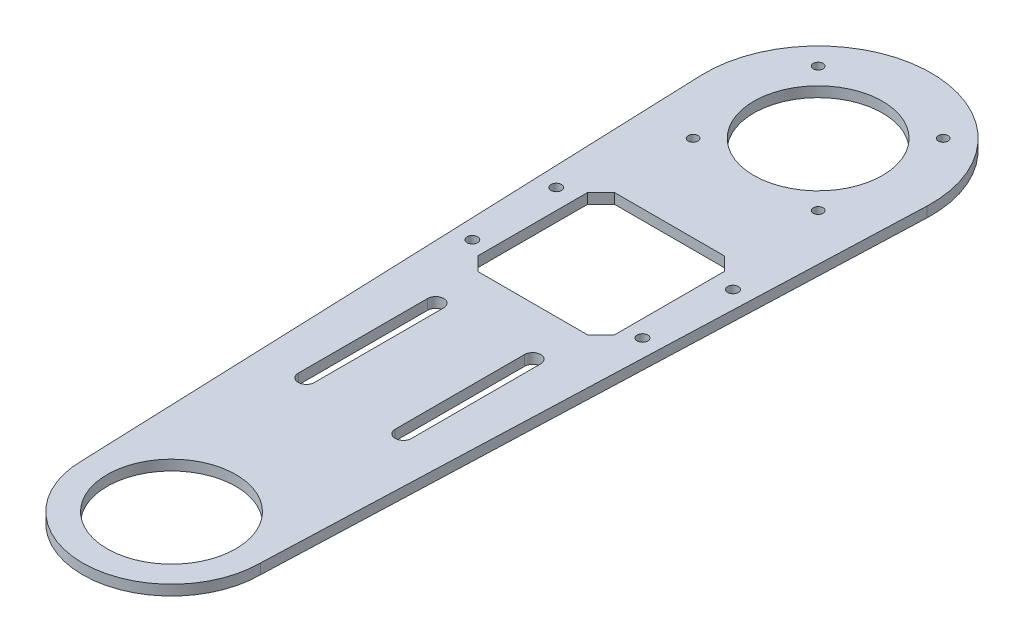
ISO-10303-21;
HEADER;
FILE_DESCRIPTION(('STEP AP214'),'2;1');
FILE_NAME('part.step','',(''),(''),'','','');
FILE_SCHEMA(('AUTOMOTIVE_DESIGN { 1 0 10303 214 1 1 1 1 }'));
ENDSEC;
DATA;
#1=APPLICATION_CONTEXT('core data for automotive mechanical design processes');
#2=APPLICATION_PROTOCOL_DEFINITION('international standard','automotive_design',2000,#1);
#3=PRODUCT_CONTEXT('',#1,'mechanical');
#4=PRODUCT('Part','Part','',(#3));
#5=PRODUCT_RELATED_PRODUCT_CATEGORY('part','',(#4));
#6=PRODUCT_DEFINITION_FORMATION('','',#4);
#7=PRODUCT_DEFINITION_CONTEXT('part definition',#1,'design');
#8=PRODUCT_DEFINITION('design','',#6,#7);
#9=PRODUCT_DEFINITION_SHAPE('','',#8);
#10=(LENGTH_UNIT() NAMED_UNIT(*) SI_UNIT(.MILLI.,.METRE.));
#11=(NAMED_UNIT(*) PLANE_ANGLE_UNIT() SI_UNIT($,.RADIAN.));
#12=(NAMED_UNIT(*) SI_UNIT($,.STERADIAN.) SOLID_ANGLE_UNIT());
#13=UNCERTAINTY_MEASURE_WITH_UNIT(LENGTH_MEASURE(1.E-05),#10,'distance_accuracy_value','');
#14=(GEOMETRIC_REPRESENTATION_CONTEXT(3) GLOBAL_UNCERTAINTY_ASSIGNED_CONTEXT((#13)) GLOBAL_UNIT_ASSIGNED_CONTEXT((#10,
#11,#12)) REPRESENTATION_CONTEXT('',''));
#15=CARTESIAN_POINT('',(0.,0.,0.));
#16=DIRECTION('',(0.,0.,1.));
#17=DIRECTION('',(1.,0.,0.));
#18=AXIS2_PLACEMENT_3D('',#15,#16,#17);
#19=CARTESIAN_POINT('',(31.2181907364059,3.175,1.17454749419578));
#20=DIRECTION('',(-0.999292974733131,0.,-0.0375972159741945));
#21=DIRECTION('',(-0.0375972159741945,0.,0.999292974733131));
#22=AXIS2_PLACEMENT_3D('',#19,#20,#21);
#23=PLANE('',#22);
#24=DIRECTION('',(0.0375972159741945,0.,-0.999292974733131));
#25=VECTOR('',#24,1.);
#26=CARTESIAN_POINT('',(31.2181907364059,0.,1.17454749419578));
#27=LINE('',#26,#25);
#28=CARTESIAN_POINT('',(27.5,0.,100.));
#29=VERTEX_POINT('',#28);
#30=CARTESIAN_POINT('',(34.9752541156596,0.,-98.6840974409032));
#31=VERTEX_POINT('',#30);
#32=EDGE_CURVE('E356',#29,#31,#27,.T.);
#33=ORIENTED_EDGE('',*,*,#32,.T.);
#34=DIRECTION('',(0.,-1.,0.));
#35=VECTOR('',#34,1.);
#36=CARTESIAN_POINT('',(34.9752541156596,3.175,-98.6840974409032));
#37=LINE('',#36,#35);
#38=CARTESIAN_POINT('',(34.9752541156596,3.175,-98.6840974409032));
#39=VERTEX_POINT('',#38);
#40=EDGE_CURVE('E11',#39,#31,#37,.T.);
#41=ORIENTED_EDGE('',*,*,#40,.F.);
#42=DIRECTION('',(0.0375972159741945,0.,-0.999292974733131));
#43=VECTOR('',#42,1.);
#44=CARTESIAN_POINT('',(31.2181907364059,3.175,1.17454749419578));
#45=LINE('',#44,#43);
#46=CARTESIAN_POINT('',(27.5,3.175,100.));
#47=VERTEX_POINT('',#46);
#48=EDGE_CURVE('E365',#47,#39,#45,.T.);
#49=ORIENTED_EDGE('',*,*,#48,.F.);
#50=DIRECTION('',(0.,-1.,0.));
#51=VECTOR('',#50,1.);
#52=CARTESIAN_POINT('',(27.5,3.175,100.));
#53=LINE('',#52,#51);
#54=EDGE_CURVE('E376',#47,#29,#53,.T.);
#55=ORIENTED_EDGE('',*,*,#54,.T.);
#56=EDGE_LOOP('',(#33,#41,#49,#55));
#57=FACE_BOUND('',#56,.T.);
#58=ADVANCED_FACE('F35',(#57),#23,.F.);
#59=CARTESIAN_POINT('',(0.,3.175,-100.));
#60=DIRECTION('',(0.,-1.,0.));
#61=DIRECTION('',(0.,0.,-1.));
#62=AXIS2_PLACEMENT_3D('',#59,#60,#61);
#63=CYLINDRICAL_SURFACE('',#62,35.);
#64=CARTESIAN_POINT('',(0.,0.,-100.));
#65=DIRECTION('',(0.,1.,0.));
#66=DIRECTION('',(0.,0.,1.));
#67=AXIS2_PLACEMENT_3D('',#64,#65,#66);
#68=CIRCLE('',#67,35.);
#69=CARTESIAN_POINT('',(-34.9752541156596,0.,-98.6840974409032));
#70=VERTEX_POINT('',#69);
#71=EDGE_CURVE('E379',#31,#70,#68,.T.);
#72=ORIENTED_EDGE('',*,*,#71,.T.);
#73=DIRECTION('',(0.,-1.,0.));
#74=VECTOR('',#73,1.);
#75=CARTESIAN_POINT('',(-34.9752541156596,3.175,-98.6840974409032));
#76=LINE('',#75,#74);
#77=CARTESIAN_POINT('',(-34.9752541156596,3.175,-98.6840974409032));
#78=VERTEX_POINT('',#77);
#79=EDGE_CURVE('E42',#78,#70,#76,.T.);
#80=ORIENTED_EDGE('',*,*,#79,.F.);
#81=CARTESIAN_POINT('',(0.,3.175,-100.));
#82=DIRECTION('',(0.,1.,0.));
#83=DIRECTION('',(0.,0.,1.));
#84=AXIS2_PLACEMENT_3D('',#81,#82,#83);
#85=CIRCLE('',#84,35.);
#86=EDGE_CURVE('E368',#39,#78,#85,.T.);
#87=ORIENTED_EDGE('',*,*,#86,.F.);
#88=ORIENTED_EDGE('',*,*,#40,.T.);
#89=EDGE_LOOP('',(#72,#80,#87,#88));
#90=FACE_BOUND('',#89,.T.);
#91=ADVANCED_FACE('F395',(#90),#63,.T.);
#92=CARTESIAN_POINT('',(-31.2181907364059,3.175,1.17454749419578));
#93=DIRECTION('',(-0.999292974733131,0.,0.0375972159741945));
#94=DIRECTION('',(0.0375972159741945,0.,0.999292974733131));
#95=AXIS2_PLACEMENT_3D('',#92,#93,#94);
#96=PLANE('',#95);
#97=DIRECTION('',(-0.0375972159741945,0.,-0.999292974733131));
#98=VECTOR('',#97,1.);
#99=CARTESIAN_POINT('',(-31.2181907364059,0.,1.17454749419578));
#100=LINE('',#99,#98);
#101=CARTESIAN_POINT('',(-27.5,0.,100.));
#102=VERTEX_POINT('',#101);
#103=EDGE_CURVE('E382',#102,#70,#100,.T.);
#104=ORIENTED_EDGE('',*,*,#103,.F.);
#105=DIRECTION('',(0.,-1.,0.));
#106=VECTOR('',#105,1.);
#107=CARTESIAN_POINT('',(-27.5,3.175,100.));
#108=LINE('',#107,#106);
#109=CARTESIAN_POINT('',(-27.5,3.175,100.));
#110=VERTEX_POINT('',#109);
#111=EDGE_CURVE('E388',#110,#102,#108,.T.);
#112=ORIENTED_EDGE('',*,*,#111,.F.);
#113=DIRECTION('',(-0.0375972159741945,0.,-0.999292974733131));
#114=VECTOR('',#113,1.);
#115=CARTESIAN_POINT('',(-31.2181907364059,3.175,1.17454749419578));
#116=LINE('',#115,#114);
#117=EDGE_CURVE('E371',#110,#78,#116,.T.);
#118=ORIENTED_EDGE('',*,*,#117,.T.);
#119=ORIENTED_EDGE('',*,*,#79,.T.);
#120=EDGE_LOOP('',(#104,#112,#118,#119));
#121=FACE_BOUND('',#120,.T.);
#122=ADVANCED_FACE('F392',(#121),#96,.T.);
#123=CARTESIAN_POINT('',(0.,3.175,100.));
#124=DIRECTION('',(0.,-1.,0.));
#125=DIRECTION('',(0.,0.,-1.));
#126=AXIS2_PLACEMENT_3D('',#123,#124,#125);
#127=CYLINDRICAL_SURFACE('',#126,27.5);
#128=CARTESIAN_POINT('',(0.,0.,100.));
#129=DIRECTION('',(0.,1.,0.));
#130=DIRECTION('',(0.,0.,1.));
#131=AXIS2_PLACEMENT_3D('',#128,#129,#130);
#132=CIRCLE('',#131,27.5);
#133=EDGE_CURVE('E369',#102,#29,#132,.T.);
#134=ORIENTED_EDGE('',*,*,#133,.T.);
#135=ORIENTED_EDGE('',*,*,#54,.F.);
#136=CARTESIAN_POINT('',(0.,3.175,100.));
#137=DIRECTION('',(0.,1.,0.));
#138=DIRECTION('',(0.,0.,1.));
#139=AXIS2_PLACEMENT_3D('',#136,#137,#138);
#140=CIRCLE('',#139,27.5);
#141=EDGE_CURVE('E374',#110,#47,#140,.T.);
#142=ORIENTED_EDGE('',*,*,#141,.F.);
#143=ORIENTED_EDGE('',*,*,#111,.T.);
#144=EDGE_LOOP('',(#134,#135,#142,#143));
#145=FACE_BOUND('',#144,.T.);
#146=ADVANCED_FACE('F402',(#145),#127,.T.);
#147=CARTESIAN_POINT('',(0.,3.175,0.));
#148=DIRECTION('',(0.,1.,0.));
#149=DIRECTION('',(0.,0.,1.));
#150=AXIS2_PLACEMENT_3D('',#147,#148,#149);
#151=PLANE('',#150);
#152=CARTESIAN_POINT('',(15.,3.175,43.3));
#153=DIRECTION('',(0.,1.,0.));
#154=DIRECTION('',(0.,0.,1.));
#155=AXIS2_PLACEMENT_3D('',#152,#153,#154);
#156=CIRCLE('',#155,2.5);
#157=CARTESIAN_POINT('',(12.5,3.175,43.3));
#158=VERTEX_POINT('',#157);
#159=CARTESIAN_POINT('',(17.5,3.175,43.3));
#160=VERTEX_POINT('',#159);
#161=EDGE_CURVE('E49',#158,#160,#156,.T.);
#162=ORIENTED_EDGE('',*,*,#161,.F.);
#163=DIRECTION('',(0.,0.,1.));
#164=VECTOR('',#163,1.);
#165=CARTESIAN_POINT('',(12.5,3.175,3.29999999999997));
#166=LINE('',#165,#164);
#167=CARTESIAN_POINT('',(12.5,3.175,3.29999999999997));
#168=VERTEX_POINT('',#167);
#169=EDGE_CURVE('E192',#168,#158,#166,.T.);
#170=ORIENTED_EDGE('',*,*,#169,.F.);
#171=CARTESIAN_POINT('',(15.,3.175,3.29999999999997));
#172=DIRECTION('',(0.,1.,0.));
#173=DIRECTION('',(0.,0.,1.));
#174=AXIS2_PLACEMENT_3D('',#171,#172,#173);
#175=CIRCLE('',#174,2.5);
#176=CARTESIAN_POINT('',(17.5,3.175,3.29999999999997));
#177=VERTEX_POINT('',#176);
#178=EDGE_CURVE('E195',#177,#168,#175,.T.);
#179=ORIENTED_EDGE('',*,*,#178,.F.);
#180=DIRECTION('',(0.,0.,-1.));
#181=VECTOR('',#180,1.);
#182=CARTESIAN_POINT('',(17.5,3.175,43.3));
#183=LINE('',#182,#181);
#184=EDGE_CURVE('E201',#160,#177,#183,.T.);
#185=ORIENTED_EDGE('',*,*,#184,.F.);
#186=EDGE_LOOP('',(#162,#170,#179,#185));
#187=FACE_BOUND('',#186,.T.);
#188=CARTESIAN_POINT('',(-15.,3.175,43.3));
#189=DIRECTION('',(0.,1.,0.));
#190=DIRECTION('',(0.,0.,1.));
#191=AXIS2_PLACEMENT_3D('',#188,#189,#190);
#192=CIRCLE('',#191,2.5);
#193=CARTESIAN_POINT('',(-17.5,3.175,43.3));
#194=VERTEX_POINT('',#193);
#195=CARTESIAN_POINT('',(-12.5,3.175,43.3));
#196=VERTEX_POINT('',#195);
#197=EDGE_CURVE('E57',#194,#196,#192,.T.);
#198=ORIENTED_EDGE('',*,*,#197,.F.);
#199=DIRECTION('',(0.,0.,1.));
#200=VECTOR('',#199,1.);
#201=CARTESIAN_POINT('',(-17.5,3.175,3.29999999999997));
#202=LINE('',#201,#200);
#203=CARTESIAN_POINT('',(-17.5,3.175,3.29999999999997));
#204=VERTEX_POINT('',#203);
#205=EDGE_CURVE('E216',#204,#194,#202,.T.);
#206=ORIENTED_EDGE('',*,*,#205,.F.);
#207=CARTESIAN_POINT('',(-15.,3.175,3.29999999999997));
#208=DIRECTION('',(0.,1.,0.));
#209=DIRECTION('',(0.,0.,1.));
#210=AXIS2_PLACEMENT_3D('',#207,#208,#209);
#211=CIRCLE('',#210,2.5);
#212=CARTESIAN_POINT('',(-12.5,3.175,3.29999999999997));
#213=VERTEX_POINT('',#212);
#214=EDGE_CURVE('E230',#213,#204,#211,.T.);
#215=ORIENTED_EDGE('',*,*,#214,.F.);
#216=DIRECTION('',(0.,0.,-1.));
#217=VECTOR('',#216,1.);
#218=CARTESIAN_POINT('',(-12.5,3.175,43.3));
#219=LINE('',#218,#217);
#220=EDGE_CURVE('E227',#196,#213,#219,.T.);
#221=ORIENTED_EDGE('',*,*,#220,.F.);
#222=EDGE_LOOP('',(#198,#206,#215,#221));
#223=FACE_BOUND('',#222,.T.);
#224=CARTESIAN_POINT('',(27.331724457447,3.175,-46.3404551588972));
#225=DIRECTION('',(0.,1.,0.));
#226=DIRECTION('',(0.,0.,1.));
#227=AXIS2_PLACEMENT_3D('',#224,#225,#226);
#228=CIRCLE('',#227,1.62499999999999);
#229=CARTESIAN_POINT('',(27.331724457447,3.175,-44.7154551588972));
#230=VERTEX_POINT('',#229);
#231=EDGE_CURVE('E208',#230,#230,#228,.T.);
#232=ORIENTED_EDGE('',*,*,#231,.F.);
#233=EDGE_LOOP('',(#232));
#234=FACE_BOUND('',#233,.T.);
#235=CARTESIAN_POINT('',(26.3165996261438,3.175,-19.3595448411027));
#236=DIRECTION('',(0.,1.,0.));
#237=DIRECTION('',(0.,0.,1.));
#238=AXIS2_PLACEMENT_3D('',#235,#236,#237);
#239=CIRCLE('',#238,1.62499999999999);
#240=CARTESIAN_POINT('',(26.3165996261438,3.175,-17.7345448411027));
#241=VERTEX_POINT('',#240);
#242=EDGE_CURVE('E257',#241,#241,#239,.T.);
#243=ORIENTED_EDGE('',*,*,#242,.F.);
#244=EDGE_LOOP('',(#243));
#245=FACE_BOUND('',#244,.T.);
#246=CARTESIAN_POINT('',(-26.3165996261438,3.175,-19.3595448411027));
#247=DIRECTION('',(0.,1.,0.));
#248=DIRECTION('',(0.,0.,1.));
#249=AXIS2_PLACEMENT_3D('',#246,#247,#248);
#250=CIRCLE('',#249,1.62499999999999);
#251=CARTESIAN_POINT('',(-26.3165996261438,3.175,-17.7345448411027));
#252=VERTEX_POINT('',#251);
#253=EDGE_CURVE('E251',#252,#252,#250,.T.);
#254=ORIENTED_EDGE('',*,*,#253,.F.);
#255=EDGE_LOOP('',(#254));
#256=FACE_BOUND('',#255,.T.);
#257=CARTESIAN_POINT('',(-27.331724457447,3.175,-46.3404551588972));
#258=DIRECTION('',(0.,1.,0.));
#259=DIRECTION('',(0.,0.,1.));
#260=AXIS2_PLACEMENT_3D('',#257,#258,#259);
#261=CIRCLE('',#260,1.625);
#262=CARTESIAN_POINT('',(-27.331724457447,3.175,-44.7154551588972));
#263=VERTEX_POINT('',#262);
#264=EDGE_CURVE('E245',#263,#263,#261,.T.);
#265=ORIENTED_EDGE('',*,*,#264,.F.);
#266=EDGE_LOOP('',(#265));
#267=FACE_BOUND('',#266,.T.);
#268=DIRECTION('',(0.,0.,1.));
#269=VECTOR('',#268,1.);
#270=CARTESIAN_POINT('',(-21.15,3.175,-15.8719300090005));
#271=LINE('',#270,#269);
#272=CARTESIAN_POINT('',(-21.15,3.175,-49.8280699909994));
#273=VERTEX_POINT('',#272);
#274=CARTESIAN_POINT('',(-21.15,3.175,-15.8719300090005));
#275=VERTEX_POINT('',#274);
#276=EDGE_CURVE('E244',#273,#275,#271,.T.);
#277=ORIENTED_EDGE('',*,*,#276,.F.);
#278=DIRECTION('',(-0.707106781186548,0.,0.707106781186547));
#279=VECTOR('',#278,1.);
#280=CARTESIAN_POINT('',(-21.15,3.175,-49.8280699909994));
#281=LINE('',#280,#279);
#282=CARTESIAN_POINT('',(-16.9780699909993,3.175,-54.));
#283=VERTEX_POINT('',#282);
#284=EDGE_CURVE('E269',#283,#273,#281,.T.);
#285=ORIENTED_EDGE('',*,*,#284,.F.);
#286=DIRECTION('',(-1.,0.,0.));
#287=VECTOR('',#286,1.);
#288=CARTESIAN_POINT('',(-16.9780699909993,3.175,-54.));
#289=LINE('',#288,#287);
#290=CARTESIAN_POINT('',(16.9780699909994,3.175,-54.));
#291=VERTEX_POINT('',#290);
#292=EDGE_CURVE('E307',#291,#283,#289,.T.);
#293=ORIENTED_EDGE('',*,*,#292,.F.);
#294=DIRECTION('',(-0.707106781186544,0.,-0.70710678118655));
#295=VECTOR('',#294,1.);
#296=CARTESIAN_POINT('',(16.9780699909994,3.175,-54.));
#297=LINE('',#296,#295);
#298=CARTESIAN_POINT('',(21.15,3.175,-49.8280699909994));
#299=VERTEX_POINT('',#298);
#300=EDGE_CURVE('E304',#299,#291,#297,.T.);
#301=ORIENTED_EDGE('',*,*,#300,.F.);
#302=DIRECTION('',(0.,0.,-1.));
#303=VECTOR('',#302,1.);
#304=CARTESIAN_POINT('',(21.15,3.175,-49.8280699909994));
#305=LINE('',#304,#303);
#306=CARTESIAN_POINT('',(21.15,3.175,-15.8719300090007));
#307=VERTEX_POINT('',#306);
#308=EDGE_CURVE('E301',#307,#299,#305,.T.);
#309=ORIENTED_EDGE('',*,*,#308,.F.);
#310=DIRECTION('',(0.707106781186546,0.,-0.707106781186549));
#311=VECTOR('',#310,1.);
#312=CARTESIAN_POINT('',(21.15,3.175,-15.8719300090007));
#313=LINE('',#312,#311);
#314=CARTESIAN_POINT('',(16.9780699909994,3.175,-11.7));
#315=VERTEX_POINT('',#314);
#316=EDGE_CURVE('E298',#315,#307,#313,.T.);
#317=ORIENTED_EDGE('',*,*,#316,.F.);
#318=DIRECTION('',(1.,0.,0.));
#319=VECTOR('',#318,1.);
#320=CARTESIAN_POINT('',(16.9780699909994,3.175,-11.7));
#321=LINE('',#320,#319);
#322=CARTESIAN_POINT('',(-16.9780699909993,3.175,-11.7));
#323=VERTEX_POINT('',#322);
#324=EDGE_CURVE('E295',#323,#315,#321,.T.);
#325=ORIENTED_EDGE('',*,*,#324,.F.);
#326=DIRECTION('',(0.707106781186563,0.,0.707106781186532));
#327=VECTOR('',#326,1.);
#328=CARTESIAN_POINT('',(-16.9780699909993,3.175,-11.7));
#329=LINE('',#328,#327);
#330=EDGE_CURVE('E292',#275,#323,#329,.T.);
#331=ORIENTED_EDGE('',*,*,#330,.F.);
#332=EDGE_LOOP('',(#277,#285,#293,#301,#309,#317,#325,#331));
#333=FACE_BOUND('',#332,.T.);
#334=CARTESIAN_POINT('',(-19.3393704654521,3.175,-80.6606295345479));
#335=DIRECTION('',(0.,1.,0.));
#336=DIRECTION('',(0.,0.,1.));
#337=AXIS2_PLACEMENT_3D('',#334,#335,#336);
#338=CIRCLE('',#337,1.5);
#339=CARTESIAN_POINT('',(-19.3393704654521,3.175,-79.1606295345479));
#340=VERTEX_POINT('',#339);
#341=EDGE_CURVE('E314',#340,#340,#338,.T.);
#342=ORIENTED_EDGE('',*,*,#341,.F.);
#343=EDGE_LOOP('',(#342));
#344=FACE_BOUND('',#343,.T.);
#345=CARTESIAN_POINT('',(-19.3393704654521,3.175,-119.339370465452));
#346=DIRECTION('',(0.,1.,0.));
#347=DIRECTION('',(0.,0.,1.));
#348=AXIS2_PLACEMENT_3D('',#345,#346,#347);
#349=CIRCLE('',#348,1.5);
#350=CARTESIAN_POINT('',(-19.3393704654521,3.175,-117.839370465452));
#351=VERTEX_POINT('',#350);
#352=EDGE_CURVE('E339',#351,#351,#349,.T.);
#353=ORIENTED_EDGE('',*,*,#352,.F.);
#354=EDGE_LOOP('',(#353));
#355=FACE_BOUND('',#354,.T.);
#356=CARTESIAN_POINT('',(19.3393704654521,3.175,-119.339370465452));
#357=DIRECTION('',(0.,1.,0.));
#358=DIRECTION('',(0.,0.,1.));
#359=AXIS2_PLACEMENT_3D('',#356,#357,#358);
#360=CIRCLE('',#359,1.5);
#361=CARTESIAN_POINT('',(19.3393704654521,3.175,-117.839370465452));
#362=VERTEX_POINT('',#361);
#363=EDGE_CURVE('E333',#362,#362,#360,.T.);
#364=ORIENTED_EDGE('',*,*,#363,.F.);
#365=EDGE_LOOP('',(#364));
#366=FACE_BOUND('',#365,.T.);
#367=CARTESIAN_POINT('',(19.3393704654521,3.175,-80.6606295345479));
#368=DIRECTION('',(0.,1.,0.));
#369=DIRECTION('',(0.,0.,1.));
#370=AXIS2_PLACEMENT_3D('',#367,#368,#369);
#371=CIRCLE('',#370,1.5);
#372=CARTESIAN_POINT('',(19.3393704654521,3.175,-79.1606295345479));
#373=VERTEX_POINT('',#372);
#374=EDGE_CURVE('E332',#373,#373,#371,.T.);
#375=ORIENTED_EDGE('',*,*,#374,.F.);
#376=EDGE_LOOP('',(#375));
#377=FACE_BOUND('',#376,.T.);
#378=CARTESIAN_POINT('',(0.,3.175,100.));
#379=DIRECTION('',(0.,1.,0.));
#380=DIRECTION('',(0.,0.,1.));
#381=AXIS2_PLACEMENT_3D('',#378,#379,#380);
#382=CIRCLE('',#381,19.9);
#383=CARTESIAN_POINT('',(0.,3.175,119.9));
#384=VERTEX_POINT('',#383);
#385=EDGE_CURVE('E357',#384,#384,#382,.T.);
#386=ORIENTED_EDGE('',*,*,#385,.F.);
#387=EDGE_LOOP('',(#386));
#388=FACE_BOUND('',#387,.T.);
#389=CARTESIAN_POINT('',(0.,3.175,-100.));
#390=DIRECTION('',(0.,1.,0.));
#391=DIRECTION('',(0.,0.,1.));
#392=AXIS2_PLACEMENT_3D('',#389,#390,#391);
#393=CIRCLE('',#392,19.9);
#394=CARTESIAN_POINT('',(0.,3.175,-80.1));
#395=VERTEX_POINT('',#394);
#396=EDGE_CURVE('E350',#395,#395,#393,.T.);
#397=ORIENTED_EDGE('',*,*,#396,.F.);
#398=EDGE_LOOP('',(#397));
#399=FACE_BOUND('',#398,.T.);
#400=ORIENTED_EDGE('',*,*,#48,.T.);
#401=ORIENTED_EDGE('',*,*,#86,.T.);
#402=ORIENTED_EDGE('',*,*,#117,.F.);
#403=ORIENTED_EDGE('',*,*,#141,.T.);
#404=EDGE_LOOP('',(#400,#401,#402,#403));
#405=FACE_BOUND('',#404,.T.);
#406=ADVANCED_FACE('F407',(#187,#223,#234,#245,#256,#267,#333,#344,#355,#366,#377,#388,#399,
#405),#151,.T.);
#407=CARTESIAN_POINT('',(0.,0.,0.));
#408=DIRECTION('',(0.,1.,0.));
#409=DIRECTION('',(0.,0.,1.));
#410=AXIS2_PLACEMENT_3D('',#407,#408,#409);
#411=PLANE('',#410);
#412=DIRECTION('',(0.,0.,1.));
#413=VECTOR('',#412,1.);
#414=CARTESIAN_POINT('',(12.5,0.,3.29999999999997));
#415=LINE('',#414,#413);
#416=CARTESIAN_POINT('',(12.5,0.,3.29999999999997));
#417=VERTEX_POINT('',#416);
#418=CARTESIAN_POINT('',(12.5,0.,43.3));
#419=VERTEX_POINT('',#418);
#420=EDGE_CURVE('E179',#417,#419,#415,.T.);
#421=ORIENTED_EDGE('',*,*,#420,.T.);
#422=CARTESIAN_POINT('',(15.,0.,43.3));
#423=DIRECTION('',(0.,1.,0.));
#424=DIRECTION('',(0.,0.,1.));
#425=AXIS2_PLACEMENT_3D('',#422,#423,#424);
#426=CIRCLE('',#425,2.5);
#427=CARTESIAN_POINT('',(17.5,0.,43.3));
#428=VERTEX_POINT('',#427);
#429=EDGE_CURVE('E173',#419,#428,#426,.T.);
#430=ORIENTED_EDGE('',*,*,#429,.T.);
#431=DIRECTION('',(0.,0.,-1.));
#432=VECTOR('',#431,1.);
#433=CARTESIAN_POINT('',(17.5,0.,43.3));
#434=LINE('',#433,#432);
#435=CARTESIAN_POINT('',(17.5,0.,3.29999999999997));
#436=VERTEX_POINT('',#435);
#437=EDGE_CURVE('E183',#428,#436,#434,.T.);
#438=ORIENTED_EDGE('',*,*,#437,.T.);
#439=CARTESIAN_POINT('',(15.,0.,3.29999999999997));
#440=DIRECTION('',(0.,1.,0.));
#441=DIRECTION('',(0.,0.,1.));
#442=AXIS2_PLACEMENT_3D('',#439,#440,#441);
#443=CIRCLE('',#442,2.5);
#444=EDGE_CURVE('E187',#436,#417,#443,.T.);
#445=ORIENTED_EDGE('',*,*,#444,.T.);
#446=EDGE_LOOP('',(#421,#430,#438,#445));
#447=FACE_BOUND('',#446,.T.);
#448=DIRECTION('',(0.,0.,1.));
#449=VECTOR('',#448,1.);
#450=CARTESIAN_POINT('',(-17.5,0.,3.29999999999997));
#451=LINE('',#450,#449);
#452=CARTESIAN_POINT('',(-17.5,0.,3.29999999999997));
#453=VERTEX_POINT('',#452);
#454=CARTESIAN_POINT('',(-17.5,0.,43.3));
#455=VERTEX_POINT('',#454);
#456=EDGE_CURVE('E222',#453,#455,#451,.T.);
#457=ORIENTED_EDGE('',*,*,#456,.T.);
#458=CARTESIAN_POINT('',(-15.,0.,43.3));
#459=DIRECTION('',(0.,1.,0.));
#460=DIRECTION('',(0.,0.,1.));
#461=AXIS2_PLACEMENT_3D('',#458,#459,#460);
#462=CIRCLE('',#461,2.5);
#463=CARTESIAN_POINT('',(-12.5,0.,43.3));
#464=VERTEX_POINT('',#463);
#465=EDGE_CURVE('E212',#455,#464,#462,.T.);
#466=ORIENTED_EDGE('',*,*,#465,.T.);
#467=DIRECTION('',(0.,0.,-1.));
#468=VECTOR('',#467,1.);
#469=CARTESIAN_POINT('',(-12.5,0.,43.3));
#470=LINE('',#469,#468);
#471=CARTESIAN_POINT('',(-12.5,0.,3.29999999999997));
#472=VERTEX_POINT('',#471);
#473=EDGE_CURVE('E215',#464,#472,#470,.T.);
#474=ORIENTED_EDGE('',*,*,#473,.T.);
#475=CARTESIAN_POINT('',(-15.,0.,3.29999999999997));
#476=DIRECTION('',(0.,1.,0.));
#477=DIRECTION('',(0.,0.,1.));
#478=AXIS2_PLACEMENT_3D('',#475,#476,#477);
#479=CIRCLE('',#478,2.5);
#480=EDGE_CURVE('E219',#472,#453,#479,.T.);
#481=ORIENTED_EDGE('',*,*,#480,.T.);
#482=EDGE_LOOP('',(#457,#466,#474,#481));
#483=FACE_BOUND('',#482,.T.);
#484=CARTESIAN_POINT('',(27.331724457447,0.,-46.3404551588972));
#485=DIRECTION('',(0.,1.,0.));
#486=DIRECTION('',(0.,0.,1.));
#487=AXIS2_PLACEMENT_3D('',#484,#485,#486);
#488=CIRCLE('',#487,1.62499999999999);
#489=CARTESIAN_POINT('',(27.331724457447,0.,-44.7154551588972));
#490=VERTEX_POINT('',#489);
#491=EDGE_CURVE('E260',#490,#490,#488,.T.);
#492=ORIENTED_EDGE('',*,*,#491,.T.);
#493=EDGE_LOOP('',(#492));
#494=FACE_BOUND('',#493,.T.);
#495=CARTESIAN_POINT('',(26.3165996261438,0.,-19.3595448411027));
#496=DIRECTION('',(0.,1.,0.));
#497=DIRECTION('',(0.,0.,1.));
#498=AXIS2_PLACEMENT_3D('',#495,#496,#497);
#499=CIRCLE('',#498,1.62499999999999);
#500=CARTESIAN_POINT('',(26.3165996261438,0.,-17.7345448411027));
#501=VERTEX_POINT('',#500);
#502=EDGE_CURVE('E254',#501,#501,#499,.T.);
#503=ORIENTED_EDGE('',*,*,#502,.T.);
#504=EDGE_LOOP('',(#503));
#505=FACE_BOUND('',#504,.T.);
#506=CARTESIAN_POINT('',(-26.3165996261438,0.,-19.3595448411027));
#507=DIRECTION('',(0.,1.,0.));
#508=DIRECTION('',(0.,0.,1.));
#509=AXIS2_PLACEMENT_3D('',#506,#507,#508);
#510=CIRCLE('',#509,1.62499999999999);
#511=CARTESIAN_POINT('',(-26.3165996261438,0.,-17.7345448411027));
#512=VERTEX_POINT('',#511);
#513=EDGE_CURVE('E248',#512,#512,#510,.T.);
#514=ORIENTED_EDGE('',*,*,#513,.T.);
#515=EDGE_LOOP('',(#514));
#516=FACE_BOUND('',#515,.T.);
#517=CARTESIAN_POINT('',(-27.331724457447,0.,-46.3404551588972));
#518=DIRECTION('',(0.,1.,0.));
#519=DIRECTION('',(0.,0.,1.));
#520=AXIS2_PLACEMENT_3D('',#517,#518,#519);
#521=CIRCLE('',#520,1.625);
#522=CARTESIAN_POINT('',(-27.331724457447,0.,-44.7154551588972));
#523=VERTEX_POINT('',#522);
#524=EDGE_CURVE('E241',#523,#523,#521,.T.);
#525=ORIENTED_EDGE('',*,*,#524,.T.);
#526=EDGE_LOOP('',(#525));
#527=FACE_BOUND('',#526,.T.);
#528=DIRECTION('',(-0.707106781186548,0.,0.707106781186547));
#529=VECTOR('',#528,1.);
#530=CARTESIAN_POINT('',(-21.15,0.,-49.8280699909994));
#531=LINE('',#530,#529);
#532=CARTESIAN_POINT('',(-16.9780699909993,0.,-54.));
#533=VERTEX_POINT('',#532);
#534=CARTESIAN_POINT('',(-21.15,0.,-49.8280699909994));
#535=VERTEX_POINT('',#534);
#536=EDGE_CURVE('E287',#533,#535,#531,.T.);
#537=ORIENTED_EDGE('',*,*,#536,.T.);
#538=DIRECTION('',(0.,0.,1.));
#539=VECTOR('',#538,1.);
#540=CARTESIAN_POINT('',(-21.15,0.,-15.8719300090005));
#541=LINE('',#540,#539);
#542=CARTESIAN_POINT('',(-21.15,0.,-15.8719300090005));
#543=VERTEX_POINT('',#542);
#544=EDGE_CURVE('E265',#535,#543,#541,.T.);
#545=ORIENTED_EDGE('',*,*,#544,.T.);
#546=DIRECTION('',(0.707106781186563,0.,0.707106781186532));
#547=VECTOR('',#546,1.);
#548=CARTESIAN_POINT('',(-16.9780699909993,0.,-11.7));
#549=LINE('',#548,#547);
#550=CARTESIAN_POINT('',(-16.9780699909993,0.,-11.7));
#551=VERTEX_POINT('',#550);
#552=EDGE_CURVE('E268',#543,#551,#549,.T.);
#553=ORIENTED_EDGE('',*,*,#552,.T.);
#554=DIRECTION('',(1.,0.,0.));
#555=VECTOR('',#554,1.);
#556=CARTESIAN_POINT('',(16.9780699909994,0.,-11.7));
#557=LINE('',#556,#555);
#558=CARTESIAN_POINT('',(16.9780699909994,0.,-11.7));
#559=VERTEX_POINT('',#558);
#560=EDGE_CURVE('E272',#551,#559,#557,.T.);
#561=ORIENTED_EDGE('',*,*,#560,.T.);
#562=DIRECTION('',(0.707106781186546,0.,-0.707106781186549));
#563=VECTOR('',#562,1.);
#564=CARTESIAN_POINT('',(21.15,0.,-15.8719300090007));
#565=LINE('',#564,#563);
#566=CARTESIAN_POINT('',(21.15,0.,-15.8719300090007));
#567=VERTEX_POINT('',#566);
#568=EDGE_CURVE('E275',#559,#567,#565,.T.);
#569=ORIENTED_EDGE('',*,*,#568,.T.);
#570=DIRECTION('',(0.,0.,-1.));
#571=VECTOR('',#570,1.);
#572=CARTESIAN_POINT('',(21.15,0.,-49.8280699909994));
#573=LINE('',#572,#571);
#574=CARTESIAN_POINT('',(21.15,0.,-49.8280699909994));
#575=VERTEX_POINT('',#574);
#576=EDGE_CURVE('E278',#567,#575,#573,.T.);
#577=ORIENTED_EDGE('',*,*,#576,.T.);
#578=DIRECTION('',(-0.707106781186544,0.,-0.70710678118655));
#579=VECTOR('',#578,1.);
#580=CARTESIAN_POINT('',(16.9780699909994,0.,-54.));
#581=LINE('',#580,#579);
#582=CARTESIAN_POINT('',(16.9780699909994,0.,-54.));
#583=VERTEX_POINT('',#582);
#584=EDGE_CURVE('E281',#575,#583,#581,.T.);
#585=ORIENTED_EDGE('',*,*,#584,.T.);
#586=DIRECTION('',(-1.,0.,0.));
#587=VECTOR('',#586,1.);
#588=CARTESIAN_POINT('',(-16.9780699909993,0.,-54.));
#589=LINE('',#588,#587);
#590=EDGE_CURVE('E284',#583,#533,#589,.T.);
#591=ORIENTED_EDGE('',*,*,#590,.T.);
#592=EDGE_LOOP('',(#537,#545,#553,#561,#569,#577,#585,#591));
#593=FACE_BOUND('',#592,.T.);
#594=CARTESIAN_POINT('',(-19.3393704654521,0.,-80.6606295345479));
#595=DIRECTION('',(0.,1.,0.));
#596=DIRECTION('',(0.,0.,1.));
#597=AXIS2_PLACEMENT_3D('',#594,#595,#596);
#598=CIRCLE('',#597,1.5);
#599=CARTESIAN_POINT('',(-19.3393704654521,0.,-79.1606295345479));
#600=VERTEX_POINT('',#599);
#601=EDGE_CURVE('E342',#600,#600,#598,.T.);
#602=ORIENTED_EDGE('',*,*,#601,.T.);
#603=EDGE_LOOP('',(#602));
#604=FACE_BOUND('',#603,.T.);
#605=CARTESIAN_POINT('',(-19.3393704654521,0.,-119.339370465452));
#606=DIRECTION('',(0.,1.,0.));
#607=DIRECTION('',(0.,0.,1.));
#608=AXIS2_PLACEMENT_3D('',#605,#606,#607);
#609=CIRCLE('',#608,1.5);
#610=CARTESIAN_POINT('',(-19.3393704654521,0.,-117.839370465452));
#611=VERTEX_POINT('',#610);
#612=EDGE_CURVE('E336',#611,#611,#609,.T.);
#613=ORIENTED_EDGE('',*,*,#612,.T.);
#614=EDGE_LOOP('',(#613));
#615=FACE_BOUND('',#614,.T.);
#616=CARTESIAN_POINT('',(19.3393704654521,0.,-119.339370465452));
#617=DIRECTION('',(0.,1.,0.));
#618=DIRECTION('',(0.,0.,1.));
#619=AXIS2_PLACEMENT_3D('',#616,#617,#618);
#620=CIRCLE('',#619,1.5);
#621=CARTESIAN_POINT('',(19.3393704654521,0.,-117.839370465452));
#622=VERTEX_POINT('',#621);
#623=EDGE_CURVE('E329',#622,#622,#620,.T.);
#624=ORIENTED_EDGE('',*,*,#623,.T.);
#625=EDGE_LOOP('',(#624));
#626=FACE_BOUND('',#625,.T.);
#627=CARTESIAN_POINT('',(19.3393704654521,0.,-80.6606295345479));
#628=DIRECTION('',(0.,1.,0.));
#629=DIRECTION('',(0.,0.,1.));
#630=AXIS2_PLACEMENT_3D('',#627,#628,#629);
#631=CIRCLE('',#630,1.5);
#632=CARTESIAN_POINT('',(19.3393704654521,0.,-79.1606295345479));
#633=VERTEX_POINT('',#632);
#634=EDGE_CURVE('E347',#633,#633,#631,.T.);
#635=ORIENTED_EDGE('',*,*,#634,.T.);
#636=EDGE_LOOP('',(#635));
#637=FACE_BOUND('',#636,.T.);
#638=CARTESIAN_POINT('',(0.,0.,100.));
#639=DIRECTION('',(0.,1.,0.));
#640=DIRECTION('',(0.,0.,1.));
#641=AXIS2_PLACEMENT_3D('',#638,#639,#640);
#642=CIRCLE('',#641,19.9);
#643=CARTESIAN_POINT('',(0.,0.,119.9));
#644=VERTEX_POINT('',#643);
#645=EDGE_CURVE('E353',#644,#644,#642,.T.);
#646=ORIENTED_EDGE('',*,*,#645,.T.);
#647=EDGE_LOOP('',(#646));
#648=FACE_BOUND('',#647,.T.);
#649=CARTESIAN_POINT('',(0.,0.,-100.));
#650=DIRECTION('',(0.,1.,0.));
#651=DIRECTION('',(0.,0.,1.));
#652=AXIS2_PLACEMENT_3D('',#649,#650,#651);
#653=CIRCLE('',#652,19.9);
#654=CARTESIAN_POINT('',(0.,0.,-80.1));
#655=VERTEX_POINT('',#654);
#656=EDGE_CURVE('E360',#655,#655,#653,.T.);
#657=ORIENTED_EDGE('',*,*,#656,.T.);
#658=EDGE_LOOP('',(#657));
#659=FACE_BOUND('',#658,.T.);
#660=ORIENTED_EDGE('',*,*,#32,.F.);
#661=ORIENTED_EDGE('',*,*,#133,.F.);
#662=ORIENTED_EDGE('',*,*,#103,.T.);
#663=ORIENTED_EDGE('',*,*,#71,.F.);
#664=EDGE_LOOP('',(#660,#661,#662,#663));
#665=FACE_BOUND('',#664,.T.);
#666=ADVANCED_FACE('F189',(#447,#483,#494,#505,#516,#527,#593,#604,#615,#626,#637,#648,#659,
#665),#411,.F.);
#667=CARTESIAN_POINT('',(0.,0.,-100.));
#668=DIRECTION('',(0.,1.,0.));
#669=DIRECTION('',(0.,0.,1.));
#670=AXIS2_PLACEMENT_3D('',#667,#668,#669);
#671=CYLINDRICAL_SURFACE('',#670,19.9);
#672=ORIENTED_EDGE('',*,*,#656,.F.);
#673=EDGE_LOOP('',(#672));
#674=FACE_BOUND('',#673,.T.);
#675=ORIENTED_EDGE('',*,*,#396,.T.);
#676=EDGE_LOOP('',(#675));
#677=FACE_BOUND('',#676,.T.);
#678=ADVANCED_FACE('F415',(#674,#677),#671,.F.);
#679=CARTESIAN_POINT('',(0.,0.,100.));
#680=DIRECTION('',(0.,1.,0.));
#681=DIRECTION('',(0.,0.,1.));
#682=AXIS2_PLACEMENT_3D('',#679,#680,#681);
#683=CYLINDRICAL_SURFACE('',#682,19.9);
#684=ORIENTED_EDGE('',*,*,#645,.F.);
#685=EDGE_LOOP('',(#684));
#686=FACE_BOUND('',#685,.T.);
#687=ORIENTED_EDGE('',*,*,#385,.T.);
#688=EDGE_LOOP('',(#687));
#689=FACE_BOUND('',#688,.T.);
#690=ADVANCED_FACE('F444',(#686,#689),#683,.F.);
#691=CARTESIAN_POINT('',(19.3393704654521,0.,-80.6606295345479));
#692=DIRECTION('',(0.,1.,0.));
#693=DIRECTION('',(0.,0.,1.));
#694=AXIS2_PLACEMENT_3D('',#691,#692,#693);
#695=CYLINDRICAL_SURFACE('',#694,1.5);
#696=ORIENTED_EDGE('',*,*,#634,.F.);
#697=EDGE_LOOP('',(#696));
#698=FACE_BOUND('',#697,.T.);
#699=ORIENTED_EDGE('',*,*,#374,.T.);
#700=EDGE_LOOP('',(#699));
#701=FACE_BOUND('',#700,.T.);
#702=ADVANCED_FACE('F454',(#698,#701),#695,.F.);
#703=CARTESIAN_POINT('',(19.3393704654521,0.,-119.339370465452));
#704=DIRECTION('',(0.,1.,0.));
#705=DIRECTION('',(0.,0.,1.));
#706=AXIS2_PLACEMENT_3D('',#703,#704,#705);
#707=CYLINDRICAL_SURFACE('',#706,1.5);
#708=ORIENTED_EDGE('',*,*,#623,.F.);
#709=EDGE_LOOP('',(#708));
#710=FACE_BOUND('',#709,.T.);
#711=ORIENTED_EDGE('',*,*,#363,.T.);
#712=EDGE_LOOP('',(#711));
#713=FACE_BOUND('',#712,.T.);
#714=ADVANCED_FACE('F464',(#710,#713),#707,.F.);
#715=CARTESIAN_POINT('',(-19.3393704654521,0.,-119.339370465452));
#716=DIRECTION('',(0.,1.,0.));
#717=DIRECTION('',(0.,0.,1.));
#718=AXIS2_PLACEMENT_3D('',#715,#716,#717);
#719=CYLINDRICAL_SURFACE('',#718,1.5);
#720=ORIENTED_EDGE('',*,*,#612,.F.);
#721=EDGE_LOOP('',(#720));
#722=FACE_BOUND('',#721,.T.);
#723=ORIENTED_EDGE('',*,*,#352,.T.);
#724=EDGE_LOOP('',(#723));
#725=FACE_BOUND('',#724,.T.);
#726=ADVANCED_FACE('F474',(#722,#725),#719,.F.);
#727=CARTESIAN_POINT('',(-19.3393704654521,0.,-80.6606295345479));
#728=DIRECTION('',(0.,1.,0.));
#729=DIRECTION('',(0.,0.,1.));
#730=AXIS2_PLACEMENT_3D('',#727,#728,#729);
#731=CYLINDRICAL_SURFACE('',#730,1.5);
#732=ORIENTED_EDGE('',*,*,#601,.F.);
#733=EDGE_LOOP('',(#732));
#734=FACE_BOUND('',#733,.T.);
#735=ORIENTED_EDGE('',*,*,#341,.T.);
#736=EDGE_LOOP('',(#735));
#737=FACE_BOUND('',#736,.T.);
#738=ADVANCED_FACE('F484',(#734,#737),#731,.F.);
#739=CARTESIAN_POINT('',(-21.15,0.,-15.8719300090005));
#740=DIRECTION('',(-1.,0.,0.));
#741=DIRECTION('',(0.,0.,1.));
#742=AXIS2_PLACEMENT_3D('',#739,#740,#741);
#743=PLANE('',#742);
#744=ORIENTED_EDGE('',*,*,#276,.T.);
#745=DIRECTION('',(0.,1.,0.));
#746=VECTOR('',#745,1.);
#747=CARTESIAN_POINT('',(-21.15,0.,-15.8719300090005));
#748=LINE('',#747,#746);
#749=EDGE_CURVE('E290',#543,#275,#748,.T.);
#750=ORIENTED_EDGE('',*,*,#749,.F.);
#751=ORIENTED_EDGE('',*,*,#544,.F.);
#752=DIRECTION('',(0.,1.,0.));
#753=VECTOR('',#752,1.);
#754=CARTESIAN_POINT('',(-21.15,0.,-49.8280699909994));
#755=LINE('',#754,#753);
#756=EDGE_CURVE('E312',#535,#273,#755,.T.);
#757=ORIENTED_EDGE('',*,*,#756,.T.);
#758=EDGE_LOOP('',(#744,#750,#751,#757));
#759=FACE_BOUND('',#758,.T.);
#760=ADVANCED_FACE('F494',(#759),#743,.F.);
#761=CARTESIAN_POINT('',(-21.15,0.,-49.8280699909994));
#762=DIRECTION('',(-0.707106781186547,0.,-0.707106781186548));
#763=DIRECTION('',(-0.707106781186548,0.,0.707106781186547));
#764=AXIS2_PLACEMENT_3D('',#761,#762,#763);
#765=PLANE('',#764);
#766=ORIENTED_EDGE('',*,*,#284,.T.);
#767=ORIENTED_EDGE('',*,*,#756,.F.);
#768=ORIENTED_EDGE('',*,*,#536,.F.);
#769=DIRECTION('',(0.,1.,0.));
#770=VECTOR('',#769,1.);
#771=CARTESIAN_POINT('',(-16.9780699909993,0.,-54.));
#772=LINE('',#771,#770);
#773=EDGE_CURVE('E315',#533,#283,#772,.T.);
#774=ORIENTED_EDGE('',*,*,#773,.T.);
#775=EDGE_LOOP('',(#766,#767,#768,#774));
#776=FACE_BOUND('',#775,.T.);
#777=ADVANCED_FACE('F504',(#776),#765,.F.);
#778=CARTESIAN_POINT('',(-16.9780699909993,0.,-54.));
#779=DIRECTION('',(0.,0.,-1.));
#780=DIRECTION('',(-1.,0.,0.));
#781=AXIS2_PLACEMENT_3D('',#778,#779,#780);
#782=PLANE('',#781);
#783=ORIENTED_EDGE('',*,*,#292,.T.);
#784=ORIENTED_EDGE('',*,*,#773,.F.);
#785=ORIENTED_EDGE('',*,*,#590,.F.);
#786=DIRECTION('',(0.,1.,0.));
#787=VECTOR('',#786,1.);
#788=CARTESIAN_POINT('',(16.9780699909994,0.,-54.));
#789=LINE('',#788,#787);
#790=EDGE_CURVE('E317',#583,#291,#789,.T.);
#791=ORIENTED_EDGE('',*,*,#790,.T.);
#792=EDGE_LOOP('',(#783,#784,#785,#791));
#793=FACE_BOUND('',#792,.T.);
#794=ADVANCED_FACE('F514',(#793),#782,.F.);
#795=CARTESIAN_POINT('',(16.9780699909994,0.,-54.));
#796=DIRECTION('',(0.707106781186551,0.,-0.707106781186545));
#797=DIRECTION('',(-0.707106781186545,0.,-0.70710678118655));
#798=AXIS2_PLACEMENT_3D('',#795,#796,#797);
#799=PLANE('',#798);
#800=ORIENTED_EDGE('',*,*,#300,.T.);
#801=ORIENTED_EDGE('',*,*,#790,.F.);
#802=ORIENTED_EDGE('',*,*,#584,.F.);
#803=DIRECTION('',(0.,1.,0.));
#804=VECTOR('',#803,1.);
#805=CARTESIAN_POINT('',(21.15,0.,-49.8280699909994));
#806=LINE('',#805,#804);
#807=EDGE_CURVE('E319',#575,#299,#806,.T.);
#808=ORIENTED_EDGE('',*,*,#807,.T.);
#809=EDGE_LOOP('',(#800,#801,#802,#808));
#810=FACE_BOUND('',#809,.T.);
#811=ADVANCED_FACE('F524',(#810),#799,.F.);
#812=CARTESIAN_POINT('',(21.15,0.,-49.8280699909994));
#813=DIRECTION('',(1.,0.,0.));
#814=DIRECTION('',(0.,0.,-1.));
#815=AXIS2_PLACEMENT_3D('',#812,#813,#814);
#816=PLANE('',#815);
#817=ORIENTED_EDGE('',*,*,#308,.T.);
#818=ORIENTED_EDGE('',*,*,#807,.F.);
#819=ORIENTED_EDGE('',*,*,#576,.F.);
#820=DIRECTION('',(0.,1.,0.));
#821=VECTOR('',#820,1.);
#822=CARTESIAN_POINT('',(21.15,0.,-15.8719300090007));
#823=LINE('',#822,#821);
#824=EDGE_CURVE('E321',#567,#307,#823,.T.);
#825=ORIENTED_EDGE('',*,*,#824,.T.);
#826=EDGE_LOOP('',(#817,#818,#819,#825));
#827=FACE_BOUND('',#826,.T.);
#828=ADVANCED_FACE('F534',(#827),#816,.F.);
#829=CARTESIAN_POINT('',(21.15,0.,-15.8719300090007));
#830=DIRECTION('',(0.707106781186549,0.,0.707106781186546));
#831=DIRECTION('',(0.707106781186546,0.,-0.707106781186549));
#832=AXIS2_PLACEMENT_3D('',#829,#830,#831);
#833=PLANE('',#832);
#834=ORIENTED_EDGE('',*,*,#316,.T.);
#835=ORIENTED_EDGE('',*,*,#824,.F.);
#836=ORIENTED_EDGE('',*,*,#568,.F.);
#837=DIRECTION('',(0.,1.,0.));
#838=VECTOR('',#837,1.);
#839=CARTESIAN_POINT('',(16.9780699909994,0.,-11.7));
#840=LINE('',#839,#838);
#841=EDGE_CURVE('E323',#559,#315,#840,.T.);
#842=ORIENTED_EDGE('',*,*,#841,.T.);
#843=EDGE_LOOP('',(#834,#835,#836,#842));
#844=FACE_BOUND('',#843,.T.);
#845=ADVANCED_FACE('F544',(#844),#833,.F.);
#846=CARTESIAN_POINT('',(16.9780699909994,0.,-11.7));
#847=DIRECTION('',(0.,0.,1.));
#848=DIRECTION('',(1.,0.,0.));
#849=AXIS2_PLACEMENT_3D('',#846,#847,#848);
#850=PLANE('',#849);
#851=ORIENTED_EDGE('',*,*,#324,.T.);
#852=ORIENTED_EDGE('',*,*,#841,.F.);
#853=ORIENTED_EDGE('',*,*,#560,.F.);
#854=DIRECTION('',(0.,1.,0.));
#855=VECTOR('',#854,1.);
#856=CARTESIAN_POINT('',(-16.9780699909993,0.,-11.7));
#857=LINE('',#856,#855);
#858=EDGE_CURVE('E325',#551,#323,#857,.T.);
#859=ORIENTED_EDGE('',*,*,#858,.T.);
#860=EDGE_LOOP('',(#851,#852,#853,#859));
#861=FACE_BOUND('',#860,.T.);
#862=ADVANCED_FACE('F554',(#861),#850,.F.);
#863=CARTESIAN_POINT('',(-16.9780699909993,0.,-11.7));
#864=DIRECTION('',(-0.707106781186532,0.,0.707106781186563));
#865=DIRECTION('',(0.707106781186563,0.,0.707106781186532));
#866=AXIS2_PLACEMENT_3D('',#863,#864,#865);
#867=PLANE('',#866);
#868=ORIENTED_EDGE('',*,*,#330,.T.);
#869=ORIENTED_EDGE('',*,*,#858,.F.);
#870=ORIENTED_EDGE('',*,*,#552,.F.);
#871=ORIENTED_EDGE('',*,*,#749,.T.);
#872=EDGE_LOOP('',(#868,#869,#870,#871));
#873=FACE_BOUND('',#872,.T.);
#874=ADVANCED_FACE('F564',(#873),#867,.F.);
#875=CARTESIAN_POINT('',(-27.331724457447,0.,-46.3404551588972));
#876=DIRECTION('',(0.,1.,0.));
#877=DIRECTION('',(0.,0.,1.));
#878=AXIS2_PLACEMENT_3D('',#875,#876,#877);
#879=CYLINDRICAL_SURFACE('',#878,1.625);
#880=ORIENTED_EDGE('',*,*,#524,.F.);
#881=EDGE_LOOP('',(#880));
#882=FACE_BOUND('',#881,.T.);
#883=ORIENTED_EDGE('',*,*,#264,.T.);
#884=EDGE_LOOP('',(#883));
#885=FACE_BOUND('',#884,.T.);
#886=ADVANCED_FACE('F574',(#882,#885),#879,.F.);
#887=CARTESIAN_POINT('',(-26.3165996261438,0.,-19.3595448411027));
#888=DIRECTION('',(0.,1.,0.));
#889=DIRECTION('',(0.,0.,1.));
#890=AXIS2_PLACEMENT_3D('',#887,#888,#889);
#891=CYLINDRICAL_SURFACE('',#890,1.62499999999999);
#892=ORIENTED_EDGE('',*,*,#513,.F.);
#893=EDGE_LOOP('',(#892));
#894=FACE_BOUND('',#893,.T.);
#895=ORIENTED_EDGE('',*,*,#253,.T.);
#896=EDGE_LOOP('',(#895));
#897=FACE_BOUND('',#896,.T.);
#898=ADVANCED_FACE('F584',(#894,#897),#891,.F.);
#899=CARTESIAN_POINT('',(26.3165996261438,0.,-19.3595448411027));
#900=DIRECTION('',(0.,1.,0.));
#901=DIRECTION('',(0.,0.,1.));
#902=AXIS2_PLACEMENT_3D('',#899,#900,#901);
#903=CYLINDRICAL_SURFACE('',#902,1.62499999999999);
#904=ORIENTED_EDGE('',*,*,#502,.F.);
#905=EDGE_LOOP('',(#904));
#906=FACE_BOUND('',#905,.T.);
#907=ORIENTED_EDGE('',*,*,#242,.T.);
#908=EDGE_LOOP('',(#907));
#909=FACE_BOUND('',#908,.T.);
#910=ADVANCED_FACE('F594',(#906,#909),#903,.F.);
#911=CARTESIAN_POINT('',(27.331724457447,0.,-46.3404551588972));
#912=DIRECTION('',(0.,1.,0.));
#913=DIRECTION('',(0.,0.,1.));
#914=AXIS2_PLACEMENT_3D('',#911,#912,#913);
#915=CYLINDRICAL_SURFACE('',#914,1.62499999999999);
#916=ORIENTED_EDGE('',*,*,#491,.F.);
#917=EDGE_LOOP('',(#916));
#918=FACE_BOUND('',#917,.T.);
#919=ORIENTED_EDGE('',*,*,#231,.T.);
#920=EDGE_LOOP('',(#919));
#921=FACE_BOUND('',#920,.T.);
#922=ADVANCED_FACE('F604',(#918,#921),#915,.F.);
#923=CARTESIAN_POINT('',(-15.,0.,43.3));
#924=DIRECTION('',(0.,1.,0.));
#925=DIRECTION('',(0.,0.,1.));
#926=AXIS2_PLACEMENT_3D('',#923,#924,#925);
#927=CYLINDRICAL_SURFACE('',#926,2.5);
#928=ORIENTED_EDGE('',*,*,#197,.T.);
#929=DIRECTION('',(0.,1.,0.));
#930=VECTOR('',#929,1.);
#931=CARTESIAN_POINT('',(-12.5,0.,43.3));
#932=LINE('',#931,#930);
#933=EDGE_CURVE('E225',#464,#196,#932,.T.);
#934=ORIENTED_EDGE('',*,*,#933,.F.);
#935=ORIENTED_EDGE('',*,*,#465,.F.);
#936=DIRECTION('',(0.,1.,0.));
#937=VECTOR('',#936,1.);
#938=CARTESIAN_POINT('',(-17.5,0.,43.3));
#939=LINE('',#938,#937);
#940=EDGE_CURVE('E202',#455,#194,#939,.T.);
#941=ORIENTED_EDGE('',*,*,#940,.T.);
#942=EDGE_LOOP('',(#928,#934,#935,#941));
#943=FACE_BOUND('',#942,.T.);
#944=ADVANCED_FACE('F613',(#943),#927,.F.);
#945=CARTESIAN_POINT('',(-17.5,0.,3.29999999999997));
#946=DIRECTION('',(-1.,0.,0.));
#947=DIRECTION('',(0.,0.,1.));
#948=AXIS2_PLACEMENT_3D('',#945,#946,#947);
#949=PLANE('',#948);
#950=ORIENTED_EDGE('',*,*,#205,.T.);
#951=ORIENTED_EDGE('',*,*,#940,.F.);
#952=ORIENTED_EDGE('',*,*,#456,.F.);
#953=DIRECTION('',(0.,1.,0.));
#954=VECTOR('',#953,1.);
#955=CARTESIAN_POINT('',(-17.5,0.,3.29999999999997));
#956=LINE('',#955,#954);
#957=EDGE_CURVE('E236',#453,#204,#956,.T.);
#958=ORIENTED_EDGE('',*,*,#957,.T.);
#959=EDGE_LOOP('',(#950,#951,#952,#958));
#960=FACE_BOUND('',#959,.T.);
#961=ADVANCED_FACE('F632',(#960),#949,.F.);
#962=CARTESIAN_POINT('',(-15.,0.,3.29999999999997));
#963=DIRECTION('',(0.,1.,0.));
#964=DIRECTION('',(0.,0.,1.));
#965=AXIS2_PLACEMENT_3D('',#962,#963,#964);
#966=CYLINDRICAL_SURFACE('',#965,2.5);
#967=ORIENTED_EDGE('',*,*,#214,.T.);
#968=ORIENTED_EDGE('',*,*,#957,.F.);
#969=ORIENTED_EDGE('',*,*,#480,.F.);
#970=DIRECTION('',(0.,1.,0.));
#971=VECTOR('',#970,1.);
#972=CARTESIAN_POINT('',(-12.5,0.,3.29999999999997));
#973=LINE('',#972,#971);
#974=EDGE_CURVE('E238',#472,#213,#973,.T.);
#975=ORIENTED_EDGE('',*,*,#974,.T.);
#976=EDGE_LOOP('',(#967,#968,#969,#975));
#977=FACE_BOUND('',#976,.T.);
#978=ADVANCED_FACE('F641',(#977),#966,.F.);
#979=CARTESIAN_POINT('',(-12.5,0.,43.3));
#980=DIRECTION('',(1.,0.,0.));
#981=DIRECTION('',(0.,0.,-1.));
#982=AXIS2_PLACEMENT_3D('',#979,#980,#981);
#983=PLANE('',#982);
#984=ORIENTED_EDGE('',*,*,#220,.T.);
#985=ORIENTED_EDGE('',*,*,#974,.F.);
#986=ORIENTED_EDGE('',*,*,#473,.F.);
#987=ORIENTED_EDGE('',*,*,#933,.T.);
#988=EDGE_LOOP('',(#984,#985,#986,#987));
#989=FACE_BOUND('',#988,.T.);
#990=ADVANCED_FACE('F651',(#989),#983,.F.);
#991=CARTESIAN_POINT('',(15.,0.,43.3));
#992=DIRECTION('',(0.,1.,0.));
#993=DIRECTION('',(0.,0.,1.));
#994=AXIS2_PLACEMENT_3D('',#991,#992,#993);
#995=CYLINDRICAL_SURFACE('',#994,2.5);
#996=ORIENTED_EDGE('',*,*,#161,.T.);
#997=DIRECTION('',(0.,1.,0.));
#998=VECTOR('',#997,1.);
#999=CARTESIAN_POINT('',(17.5,0.,43.3));
#1000=LINE('',#999,#998);
#1001=EDGE_CURVE('E169',#428,#160,#1000,.T.);
#1002=ORIENTED_EDGE('',*,*,#1001,.F.);
#1003=ORIENTED_EDGE('',*,*,#429,.F.);
#1004=DIRECTION('',(0.,1.,0.));
#1005=VECTOR('',#1004,1.);
#1006=CARTESIAN_POINT('',(12.5,0.,43.3));
#1007=LINE('',#1006,#1005);
#1008=EDGE_CURVE('E206',#419,#158,#1007,.T.);
#1009=ORIENTED_EDGE('',*,*,#1008,.T.);
#1010=EDGE_LOOP('',(#996,#1002,#1003,#1009));
#1011=FACE_BOUND('',#1010,.T.);
#1012=ADVANCED_FACE('F171',(#1011),#995,.F.);
#1013=CARTESIAN_POINT('',(12.5,0.,3.29999999999997));
#1014=DIRECTION('',(-1.,0.,0.));
#1015=DIRECTION('',(0.,0.,1.));
#1016=AXIS2_PLACEMENT_3D('',#1013,#1014,#1015);
#1017=PLANE('',#1016);
#1018=ORIENTED_EDGE('',*,*,#169,.T.);
#1019=ORIENTED_EDGE('',*,*,#1008,.F.);
#1020=ORIENTED_EDGE('',*,*,#420,.F.);
#1021=DIRECTION('',(0.,1.,0.));
#1022=VECTOR('',#1021,1.);
#1023=CARTESIAN_POINT('',(12.5,0.,3.29999999999997));
#1024=LINE('',#1023,#1022);
#1025=EDGE_CURVE('E209',#417,#168,#1024,.T.);
#1026=ORIENTED_EDGE('',*,*,#1025,.T.);
#1027=EDGE_LOOP('',(#1018,#1019,#1020,#1026));
#1028=FACE_BOUND('',#1027,.T.);
#1029=ADVANCED_FACE('F670',(#1028),#1017,.F.);
#1030=CARTESIAN_POINT('',(15.,0.,3.29999999999997));
#1031=DIRECTION('',(0.,1.,0.));
#1032=DIRECTION('',(0.,0.,1.));
#1033=AXIS2_PLACEMENT_3D('',#1030,#1031,#1032);
#1034=CYLINDRICAL_SURFACE('',#1033,2.5);
#1035=ORIENTED_EDGE('',*,*,#178,.T.);
#1036=ORIENTED_EDGE('',*,*,#1025,.F.);
#1037=ORIENTED_EDGE('',*,*,#444,.F.);
#1038=DIRECTION('',(0.,1.,0.));
#1039=VECTOR('',#1038,1.);
#1040=CARTESIAN_POINT('',(17.5,0.,3.29999999999997));
#1041=LINE('',#1040,#1039);
#1042=EDGE_CURVE('E178',#436,#177,#1041,.T.);
#1043=ORIENTED_EDGE('',*,*,#1042,.T.);
#1044=EDGE_LOOP('',(#1035,#1036,#1037,#1043));
#1045=FACE_BOUND('',#1044,.T.);
#1046=ADVANCED_FACE('F679',(#1045),#1034,.F.);
#1047=CARTESIAN_POINT('',(17.5,0.,43.3));
#1048=DIRECTION('',(1.,0.,0.));
#1049=DIRECTION('',(0.,0.,-1.));
#1050=AXIS2_PLACEMENT_3D('',#1047,#1048,#1049);
#1051=PLANE('',#1050);
#1052=ORIENTED_EDGE('',*,*,#184,.T.);
#1053=ORIENTED_EDGE('',*,*,#1042,.F.);
#1054=ORIENTED_EDGE('',*,*,#437,.F.);
#1055=ORIENTED_EDGE('',*,*,#1001,.T.);
#1056=EDGE_LOOP('',(#1052,#1053,#1054,#1055));
#1057=FACE_BOUND('',#1056,.T.);
#1058=ADVANCED_FACE('F184',(#1057),#1051,.F.);
#1059=CLOSED_SHELL('',(#58,#91,#122,#146,#406,#666,#678,#690,#702,#714,#726,#738,#760,#777,#794,
#811,#828,#845,#862,#874,#886,#898,#910,#922,#944,#961,#978,#990,#1012,#1029,#1046,#1058));
#1060=MANIFOLD_SOLID_BREP('B2',#1059);
#1061=ADVANCED_BREP_SHAPE_REPRESENTATION('',(#18,#1060),#14);
#1062=SHAPE_DEFINITION_REPRESENTATION(#9,#1061);
ENDSEC;
END-ISO-10303-21;
